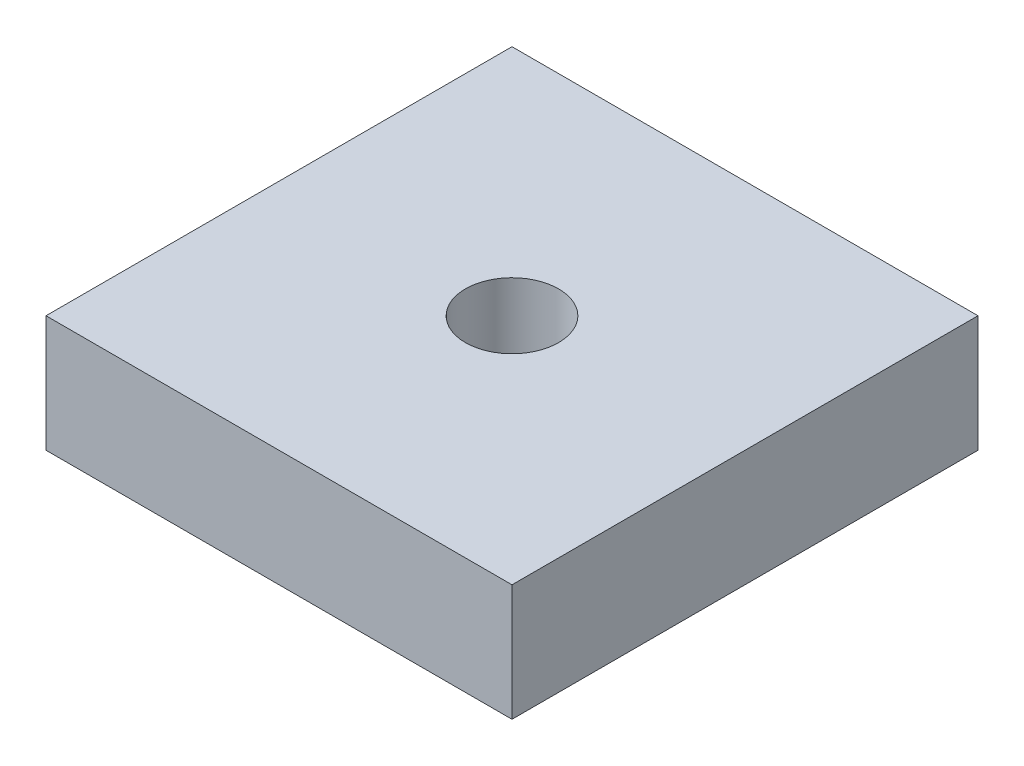
ISO-10303-21;
HEADER;
FILE_DESCRIPTION(('STEP AP214'),'2;1');
FILE_NAME('part.step','',(''),(''),'','','');
FILE_SCHEMA(('AUTOMOTIVE_DESIGN { 1 0 10303 214 1 1 1 1 }'));
ENDSEC;
DATA;
#1=APPLICATION_CONTEXT('core data for automotive mechanical design processes');
#2=APPLICATION_PROTOCOL_DEFINITION('international standard','automotive_design',2000,#1);
#3=PRODUCT_CONTEXT('',#1,'mechanical');
#4=PRODUCT('Part','Part','',(#3));
#5=PRODUCT_RELATED_PRODUCT_CATEGORY('part','',(#4));
#6=PRODUCT_DEFINITION_FORMATION('','',#4);
#7=PRODUCT_DEFINITION_CONTEXT('part definition',#1,'design');
#8=PRODUCT_DEFINITION('design','',#6,#7);
#9=PRODUCT_DEFINITION_SHAPE('','',#8);
#10=(LENGTH_UNIT() NAMED_UNIT(*) SI_UNIT(.MILLI.,.METRE.));
#11=(NAMED_UNIT(*) PLANE_ANGLE_UNIT() SI_UNIT($,.RADIAN.));
#12=(NAMED_UNIT(*) SI_UNIT($,.STERADIAN.) SOLID_ANGLE_UNIT());
#13=UNCERTAINTY_MEASURE_WITH_UNIT(LENGTH_MEASURE(1.E-05),#10,'distance_accuracy_value','');
#14=(GEOMETRIC_REPRESENTATION_CONTEXT(3) GLOBAL_UNCERTAINTY_ASSIGNED_CONTEXT((#13)) GLOBAL_UNIT_ASSIGNED_CONTEXT((#10,
#11,#12)) REPRESENTATION_CONTEXT('',''));
#15=CARTESIAN_POINT('',(0.,0.,0.));
#16=DIRECTION('',(0.,0.,1.));
#17=DIRECTION('',(1.,0.,0.));
#18=AXIS2_PLACEMENT_3D('',#15,#16,#17);
#19=CARTESIAN_POINT('',(0.,5.,0.));
#20=DIRECTION('',(0.,-1.,0.));
#21=DIRECTION('',(0.,0.,-1.));
#22=AXIS2_PLACEMENT_3D('',#19,#20,#21);
#23=PLANE('',#22);
#24=DIRECTION('',(0.,0.,-1.));
#25=VECTOR('',#24,1.);
#26=CARTESIAN_POINT('',(10.,5.,10.));
#27=LINE('',#26,#25);
#28=CARTESIAN_POINT('',(10.,5.,10.));
#29=VERTEX_POINT('',#28);
#30=CARTESIAN_POINT('',(10.,5.,-10.));
#31=VERTEX_POINT('',#30);
#32=EDGE_CURVE('E85',#29,#31,#27,.T.);
#33=ORIENTED_EDGE('',*,*,#32,.T.);
#34=DIRECTION('',(-1.,0.,0.));
#35=VECTOR('',#34,1.);
#36=CARTESIAN_POINT('',(-10.,5.,-10.));
#37=LINE('',#36,#35);
#38=CARTESIAN_POINT('',(-10.,5.,-10.));
#39=VERTEX_POINT('',#38);
#40=EDGE_CURVE('E80',#31,#39,#37,.T.);
#41=ORIENTED_EDGE('',*,*,#40,.T.);
#42=DIRECTION('',(0.,0.,1.));
#43=VECTOR('',#42,1.);
#44=CARTESIAN_POINT('',(-10.,5.,10.));
#45=LINE('',#44,#43);
#46=CARTESIAN_POINT('',(-10.,5.,10.));
#47=VERTEX_POINT('',#46);
#48=EDGE_CURVE('E83',#39,#47,#45,.T.);
#49=ORIENTED_EDGE('',*,*,#48,.T.);
#50=DIRECTION('',(1.,0.,0.));
#51=VECTOR('',#50,1.);
#52=CARTESIAN_POINT('',(-10.,5.,10.));
#53=LINE('',#52,#51);
#54=EDGE_CURVE('E50',#47,#29,#53,.T.);
#55=ORIENTED_EDGE('',*,*,#54,.T.);
#56=EDGE_LOOP('',(#33,#41,#49,#55));
#57=FACE_BOUND('',#56,.T.);
#58=CARTESIAN_POINT('',(0.,5.,0.));
#59=DIRECTION('',(0.,1.,0.));
#60=DIRECTION('',(0.,0.,1.));
#61=AXIS2_PLACEMENT_3D('',#58,#59,#60);
#62=CIRCLE('',#61,2.);
#63=CARTESIAN_POINT('',(0.,5.,2.));
#64=VERTEX_POINT('',#63);
#65=EDGE_CURVE('E100',#64,#64,#62,.T.);
#66=ORIENTED_EDGE('',*,*,#65,.F.);
#67=EDGE_LOOP('',(#66));
#68=FACE_BOUND('',#67,.T.);
#69=ADVANCED_FACE('F33',(#57,#68),#23,.F.);
#70=CARTESIAN_POINT('',(0.,0.,0.));
#71=DIRECTION('',(0.,-1.,0.));
#72=DIRECTION('',(0.,0.,-1.));
#73=AXIS2_PLACEMENT_3D('',#70,#71,#72);
#74=PLANE('',#73);
#75=DIRECTION('',(0.,0.,-1.));
#76=VECTOR('',#75,1.);
#77=CARTESIAN_POINT('',(10.,0.,10.));
#78=LINE('',#77,#76);
#79=CARTESIAN_POINT('',(10.,0.,10.));
#80=VERTEX_POINT('',#79);
#81=CARTESIAN_POINT('',(10.,0.,-10.));
#82=VERTEX_POINT('',#81);
#83=EDGE_CURVE('E97',#80,#82,#78,.T.);
#84=ORIENTED_EDGE('',*,*,#83,.F.);
#85=DIRECTION('',(1.,0.,0.));
#86=VECTOR('',#85,1.);
#87=CARTESIAN_POINT('',(-10.,0.,10.));
#88=LINE('',#87,#86);
#89=CARTESIAN_POINT('',(-10.,0.,10.));
#90=VERTEX_POINT('',#89);
#91=EDGE_CURVE('E73',#90,#80,#88,.T.);
#92=ORIENTED_EDGE('',*,*,#91,.F.);
#93=DIRECTION('',(0.,0.,1.));
#94=VECTOR('',#93,1.);
#95=CARTESIAN_POINT('',(-10.,0.,10.));
#96=LINE('',#95,#94);
#97=CARTESIAN_POINT('',(-10.,0.,-10.));
#98=VERTEX_POINT('',#97);
#99=EDGE_CURVE('E67',#98,#90,#96,.T.);
#100=ORIENTED_EDGE('',*,*,#99,.F.);
#101=DIRECTION('',(-1.,0.,0.));
#102=VECTOR('',#101,1.);
#103=CARTESIAN_POINT('',(-10.,0.,-10.));
#104=LINE('',#103,#102);
#105=EDGE_CURVE('E89',#82,#98,#104,.T.);
#106=ORIENTED_EDGE('',*,*,#105,.F.);
#107=EDGE_LOOP('',(#84,#92,#100,#106));
#108=FACE_BOUND('',#107,.T.);
#109=CARTESIAN_POINT('',(0.,0.,0.));
#110=DIRECTION('',(0.,1.,0.));
#111=DIRECTION('',(0.,0.,1.));
#112=AXIS2_PLACEMENT_3D('',#109,#110,#111);
#113=CIRCLE('',#112,2.);
#114=CARTESIAN_POINT('',(0.,0.,2.));
#115=VERTEX_POINT('',#114);
#116=EDGE_CURVE('E112',#115,#115,#113,.T.);
#117=ORIENTED_EDGE('',*,*,#116,.T.);
#118=EDGE_LOOP('',(#117));
#119=FACE_BOUND('',#118,.T.);
#120=ADVANCED_FACE('F108',(#108,#119),#74,.T.);
#121=CARTESIAN_POINT('',(10.,5.,10.));
#122=DIRECTION('',(-1.,0.,0.));
#123=DIRECTION('',(0.,0.,1.));
#124=AXIS2_PLACEMENT_3D('',#121,#122,#123);
#125=PLANE('',#124);
#126=ORIENTED_EDGE('',*,*,#83,.T.);
#127=DIRECTION('',(0.,-1.,0.));
#128=VECTOR('',#127,1.);
#129=CARTESIAN_POINT('',(10.,5.,-10.));
#130=LINE('',#129,#128);
#131=EDGE_CURVE('E11',#31,#82,#130,.T.);
#132=ORIENTED_EDGE('',*,*,#131,.F.);
#133=ORIENTED_EDGE('',*,*,#32,.F.);
#134=DIRECTION('',(0.,-1.,0.));
#135=VECTOR('',#134,1.);
#136=CARTESIAN_POINT('',(10.,5.,10.));
#137=LINE('',#136,#135);
#138=EDGE_CURVE('E93',#29,#80,#137,.T.);
#139=ORIENTED_EDGE('',*,*,#138,.T.);
#140=EDGE_LOOP('',(#126,#132,#133,#139));
#141=FACE_BOUND('',#140,.T.);
#142=ADVANCED_FACE('F35',(#141),#125,.F.);
#143=CARTESIAN_POINT('',(-10.,5.,-10.));
#144=DIRECTION('',(0.,0.,1.));
#145=DIRECTION('',(1.,0.,0.));
#146=AXIS2_PLACEMENT_3D('',#143,#144,#145);
#147=PLANE('',#146);
#148=ORIENTED_EDGE('',*,*,#105,.T.);
#149=DIRECTION('',(0.,-1.,0.));
#150=VECTOR('',#149,1.);
#151=CARTESIAN_POINT('',(-10.,5.,-10.));
#152=LINE('',#151,#150);
#153=EDGE_CURVE('E42',#39,#98,#152,.T.);
#154=ORIENTED_EDGE('',*,*,#153,.F.);
#155=ORIENTED_EDGE('',*,*,#40,.F.);
#156=ORIENTED_EDGE('',*,*,#131,.T.);
#157=EDGE_LOOP('',(#148,#154,#155,#156));
#158=FACE_BOUND('',#157,.T.);
#159=ADVANCED_FACE('F88',(#158),#147,.F.);
#160=CARTESIAN_POINT('',(-10.,5.,10.));
#161=DIRECTION('',(1.,0.,0.));
#162=DIRECTION('',(0.,0.,-1.));
#163=AXIS2_PLACEMENT_3D('',#160,#161,#162);
#164=PLANE('',#163);
#165=ORIENTED_EDGE('',*,*,#99,.T.);
#166=DIRECTION('',(0.,-1.,0.));
#167=VECTOR('',#166,1.);
#168=CARTESIAN_POINT('',(-10.,5.,10.));
#169=LINE('',#168,#167);
#170=EDGE_CURVE('E90',#47,#90,#169,.T.);
#171=ORIENTED_EDGE('',*,*,#170,.F.);
#172=ORIENTED_EDGE('',*,*,#48,.F.);
#173=ORIENTED_EDGE('',*,*,#153,.T.);
#174=EDGE_LOOP('',(#165,#171,#172,#173));
#175=FACE_BOUND('',#174,.T.);
#176=ADVANCED_FACE('F91',(#175),#164,.F.);
#177=CARTESIAN_POINT('',(-10.,5.,10.));
#178=DIRECTION('',(0.,0.,-1.));
#179=DIRECTION('',(-1.,0.,0.));
#180=AXIS2_PLACEMENT_3D('',#177,#178,#179);
#181=PLANE('',#180);
#182=ORIENTED_EDGE('',*,*,#91,.T.);
#183=ORIENTED_EDGE('',*,*,#138,.F.);
#184=ORIENTED_EDGE('',*,*,#54,.F.);
#185=ORIENTED_EDGE('',*,*,#170,.T.);
#186=EDGE_LOOP('',(#182,#183,#184,#185));
#187=FACE_BOUND('',#186,.T.);
#188=ADVANCED_FACE('F105',(#187),#181,.F.);
#189=CARTESIAN_POINT('',(0.,5.,0.));
#190=DIRECTION('',(0.,-1.,0.));
#191=DIRECTION('',(0.,0.,-1.));
#192=AXIS2_PLACEMENT_3D('',#189,#190,#191);
#193=CYLINDRICAL_SURFACE('',#192,2.);
#194=ORIENTED_EDGE('',*,*,#65,.T.);
#195=EDGE_LOOP('',(#194));
#196=FACE_BOUND('',#195,.T.);
#197=ORIENTED_EDGE('',*,*,#116,.F.);
#198=EDGE_LOOP('',(#197));
#199=FACE_BOUND('',#198,.T.);
#200=ADVANCED_FACE('F118',(#196,#199),#193,.F.);
#201=CLOSED_SHELL('',(#69,#120,#142,#159,#176,#188,#200));
#202=MANIFOLD_SOLID_BREP('B2',#201);
#203=ADVANCED_BREP_SHAPE_REPRESENTATION('',(#18,#202),#14);
#204=SHAPE_DEFINITION_REPRESENTATION(#9,#203);
ENDSEC;
END-ISO-10303-21;
